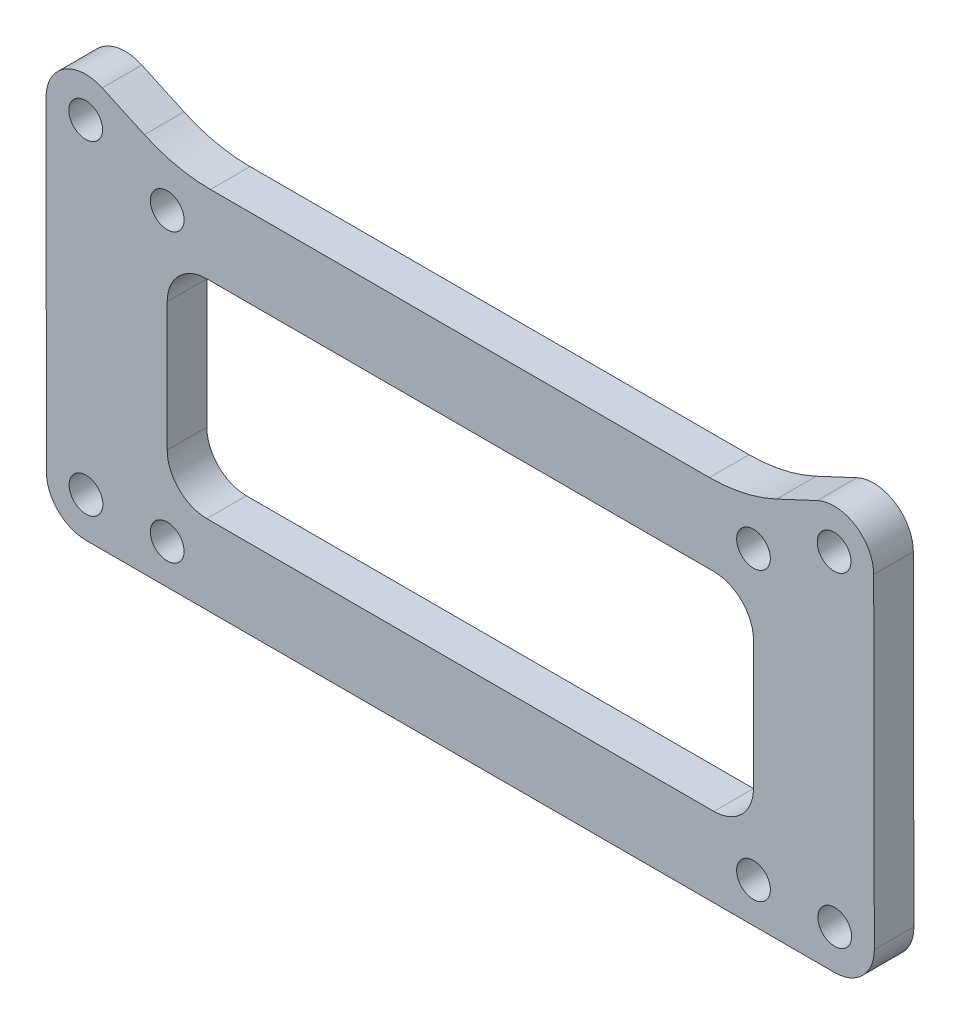
ISO-10303-21;
HEADER;
FILE_DESCRIPTION(('STEP AP214'),'2;1');
FILE_NAME('part.step','',(''),(''),'','','');
FILE_SCHEMA(('AUTOMOTIVE_DESIGN { 1 0 10303 214 1 1 1 1 }'));
ENDSEC;
DATA;
#1=APPLICATION_CONTEXT('core data for automotive mechanical design processes');
#2=APPLICATION_PROTOCOL_DEFINITION('international standard','automotive_design',2000,#1);
#3=PRODUCT_CONTEXT('',#1,'mechanical');
#4=PRODUCT('Part','Part','',(#3));
#5=PRODUCT_RELATED_PRODUCT_CATEGORY('part','',(#4));
#6=PRODUCT_DEFINITION_FORMATION('','',#4);
#7=PRODUCT_DEFINITION_CONTEXT('part definition',#1,'design');
#8=PRODUCT_DEFINITION('design','',#6,#7);
#9=PRODUCT_DEFINITION_SHAPE('','',#8);
#10=(LENGTH_UNIT() NAMED_UNIT(*) SI_UNIT(.MILLI.,.METRE.));
#11=(NAMED_UNIT(*) PLANE_ANGLE_UNIT() SI_UNIT($,.RADIAN.));
#12=(NAMED_UNIT(*) SI_UNIT($,.STERADIAN.) SOLID_ANGLE_UNIT());
#13=UNCERTAINTY_MEASURE_WITH_UNIT(LENGTH_MEASURE(1.E-05),#10,'distance_accuracy_value','');
#14=(GEOMETRIC_REPRESENTATION_CONTEXT(3) GLOBAL_UNCERTAINTY_ASSIGNED_CONTEXT((#13)) GLOBAL_UNIT_ASSIGNED_CONTEXT((#10,
#11,#12)) REPRESENTATION_CONTEXT('',''));
#15=CARTESIAN_POINT('',(0.,0.,0.));
#16=DIRECTION('',(0.,0.,1.));
#17=DIRECTION('',(1.,0.,0.));
#18=AXIS2_PLACEMENT_3D('',#15,#16,#17);
#19=CARTESIAN_POINT('',(6.5125,0.,3.175));
#20=DIRECTION('',(-1.,0.,0.));
#21=DIRECTION('',(0.,0.,1.));
#22=AXIS2_PLACEMENT_3D('',#19,#20,#21);
#23=PLANE('',#22);
#24=DIRECTION('',(0.,1.,0.));
#25=VECTOR('',#24,1.);
#26=CARTESIAN_POINT('',(6.5125,0.,3.175));
#27=LINE('',#26,#25);
#28=CARTESIAN_POINT('',(6.5125,6.34999999999997,3.175));
#29=VERTEX_POINT('',#28);
#30=CARTESIAN_POINT('',(6.5125,16.65,3.175));
#31=VERTEX_POINT('',#30);
#32=EDGE_CURVE('E279',#29,#31,#27,.T.);
#33=ORIENTED_EDGE('',*,*,#32,.F.);
#34=DIRECTION('',(0.,0.,-1.));
#35=VECTOR('',#34,1.);
#36=CARTESIAN_POINT('',(6.5125,6.34999999999997,0.));
#37=LINE('',#36,#35);
#38=CARTESIAN_POINT('',(6.5125,6.34999999999997,0.));
#39=VERTEX_POINT('',#38);
#40=EDGE_CURVE('E198',#29,#39,#37,.T.);
#41=ORIENTED_EDGE('',*,*,#40,.T.);
#42=DIRECTION('',(0.,1.,0.));
#43=VECTOR('',#42,1.);
#44=CARTESIAN_POINT('',(6.5125,0.,0.));
#45=LINE('',#44,#43);
#46=CARTESIAN_POINT('',(6.5125,16.65,0.));
#47=VERTEX_POINT('',#46);
#48=EDGE_CURVE('E313',#39,#47,#45,.T.);
#49=ORIENTED_EDGE('',*,*,#48,.T.);
#50=DIRECTION('',(0.,0.,-1.));
#51=VECTOR('',#50,1.);
#52=CARTESIAN_POINT('',(6.5125,16.65,3.175));
#53=LINE('',#52,#51);
#54=EDGE_CURVE('E196',#47,#31,#53,.F.);
#55=ORIENTED_EDGE('',*,*,#54,.T.);
#56=EDGE_LOOP('',(#33,#41,#49,#55));
#57=FACE_BOUND('',#56,.T.);
#58=ADVANCED_FACE('F35',(#57),#23,.F.);
#59=CARTESIAN_POINT('',(0.,19.825,3.175));
#60=DIRECTION('',(0.,-1.,0.));
#61=DIRECTION('',(0.,0.,-1.));
#62=AXIS2_PLACEMENT_3D('',#59,#60,#61);
#63=PLANE('',#62);
#64=DIRECTION('',(-1.,0.,0.));
#65=VECTOR('',#64,1.);
#66=CARTESIAN_POINT('',(0.,19.825,0.));
#67=LINE('',#66,#65);
#68=CARTESIAN_POINT('',(50.3375,19.825,0.));
#69=VERTEX_POINT('',#68);
#70=CARTESIAN_POINT('',(9.6875,19.825,0.));
#71=VERTEX_POINT('',#70);
#72=EDGE_CURVE('E316',#69,#71,#67,.T.);
#73=ORIENTED_EDGE('',*,*,#72,.F.);
#74=DIRECTION('',(0.,0.,-1.));
#75=VECTOR('',#74,1.);
#76=CARTESIAN_POINT('',(50.3375,19.825,3.175));
#77=LINE('',#76,#75);
#78=CARTESIAN_POINT('',(50.3375,19.825,3.175));
#79=VERTEX_POINT('',#78);
#80=EDGE_CURVE('E219',#69,#79,#77,.F.);
#81=ORIENTED_EDGE('',*,*,#80,.T.);
#82=DIRECTION('',(-1.,0.,0.));
#83=VECTOR('',#82,1.);
#84=CARTESIAN_POINT('',(0.,19.825,3.175));
#85=LINE('',#84,#83);
#86=CARTESIAN_POINT('',(9.6875,19.825,3.175));
#87=VERTEX_POINT('',#86);
#88=EDGE_CURVE('E282',#79,#87,#85,.T.);
#89=ORIENTED_EDGE('',*,*,#88,.T.);
#90=DIRECTION('',(0.,0.,-1.));
#91=VECTOR('',#90,1.);
#92=CARTESIAN_POINT('',(9.6875,19.825,3.175));
#93=LINE('',#92,#91);
#94=EDGE_CURVE('E216',#87,#71,#93,.T.);
#95=ORIENTED_EDGE('',*,*,#94,.T.);
#96=EDGE_LOOP('',(#73,#81,#89,#95));
#97=FACE_BOUND('',#96,.T.);
#98=ADVANCED_FACE('F442',(#97),#63,.T.);
#99=CARTESIAN_POINT('',(53.5125,0.,3.175));
#100=DIRECTION('',(-1.,0.,0.));
#101=DIRECTION('',(0.,0.,1.));
#102=AXIS2_PLACEMENT_3D('',#99,#100,#101);
#103=PLANE('',#102);
#104=DIRECTION('',(0.,1.,0.));
#105=VECTOR('',#104,1.);
#106=CARTESIAN_POINT('',(53.5125,0.,0.));
#107=LINE('',#106,#105);
#108=CARTESIAN_POINT('',(53.5125,6.34999999999997,0.));
#109=VERTEX_POINT('',#108);
#110=CARTESIAN_POINT('',(53.5125,16.65,0.));
#111=VERTEX_POINT('',#110);
#112=EDGE_CURVE('E319',#109,#111,#107,.T.);
#113=ORIENTED_EDGE('',*,*,#112,.F.);
#114=DIRECTION('',(0.,0.,-1.));
#115=VECTOR('',#114,1.);
#116=CARTESIAN_POINT('',(53.5125,6.34999999999997,3.175));
#117=LINE('',#116,#115);
#118=CARTESIAN_POINT('',(53.5125,6.34999999999997,3.175));
#119=VERTEX_POINT('',#118);
#120=EDGE_CURVE('E214',#109,#119,#117,.F.);
#121=ORIENTED_EDGE('',*,*,#120,.T.);
#122=DIRECTION('',(0.,1.,0.));
#123=VECTOR('',#122,1.);
#124=CARTESIAN_POINT('',(53.5125,0.,3.175));
#125=LINE('',#124,#123);
#126=CARTESIAN_POINT('',(53.5125,16.65,3.175));
#127=VERTEX_POINT('',#126);
#128=EDGE_CURVE('E285',#119,#127,#125,.T.);
#129=ORIENTED_EDGE('',*,*,#128,.T.);
#130=DIRECTION('',(0.,0.,-1.));
#131=VECTOR('',#130,1.);
#132=CARTESIAN_POINT('',(53.5125,16.65,0.));
#133=LINE('',#132,#131);
#134=EDGE_CURVE('E211',#127,#111,#133,.T.);
#135=ORIENTED_EDGE('',*,*,#134,.T.);
#136=EDGE_LOOP('',(#113,#121,#129,#135));
#137=FACE_BOUND('',#136,.T.);
#138=ADVANCED_FACE('F448',(#137),#103,.T.);
#139=CARTESIAN_POINT('',(0.,0.,3.175));
#140=DIRECTION('',(0.,0.,-1.));
#141=DIRECTION('',(-1.,0.,0.));
#142=AXIS2_PLACEMENT_3D('',#139,#140,#141);
#143=CYLINDRICAL_SURFACE('',#142,3.175);
#144=CARTESIAN_POINT('',(0.,0.,0.));
#145=DIRECTION('',(0.,0.,1.));
#146=DIRECTION('',(1.,0.,0.));
#147=AXIS2_PLACEMENT_3D('',#144,#145,#146);
#148=CIRCLE('',#147,3.175);
#149=CARTESIAN_POINT('',(-3.175,0.,0.));
#150=VERTEX_POINT('',#149);
#151=CARTESIAN_POINT('',(0.,-3.17500000000001,0.));
#152=VERTEX_POINT('',#151);
#153=EDGE_CURVE('E195',#150,#152,#148,.T.);
#154=ORIENTED_EDGE('',*,*,#153,.T.);
#155=DIRECTION('',(0.,0.,-1.));
#156=VECTOR('',#155,1.);
#157=CARTESIAN_POINT('',(0.,-3.17500000000001,3.175));
#158=LINE('',#157,#156);
#159=CARTESIAN_POINT('',(0.,-3.17500000000001,3.175));
#160=VERTEX_POINT('',#159);
#161=EDGE_CURVE('E176',#160,#152,#158,.T.);
#162=ORIENTED_EDGE('',*,*,#161,.F.);
#163=CARTESIAN_POINT('',(0.,0.,3.175));
#164=DIRECTION('',(0.,0.,1.));
#165=DIRECTION('',(1.,0.,0.));
#166=AXIS2_PLACEMENT_3D('',#163,#164,#165);
#167=CIRCLE('',#166,3.175);
#168=CARTESIAN_POINT('',(-3.175,0.,3.175));
#169=VERTEX_POINT('',#168);
#170=EDGE_CURVE('E182',#169,#160,#167,.T.);
#171=ORIENTED_EDGE('',*,*,#170,.F.);
#172=DIRECTION('',(0.,0.,-1.));
#173=VECTOR('',#172,1.);
#174=CARTESIAN_POINT('',(-3.175,0.,3.175));
#175=LINE('',#174,#173);
#176=EDGE_CURVE('E291',#169,#150,#175,.T.);
#177=ORIENTED_EDGE('',*,*,#176,.T.);
#178=EDGE_LOOP('',(#154,#162,#171,#177));
#179=FACE_BOUND('',#178,.T.);
#180=ADVANCED_FACE('F193',(#179),#143,.T.);
#181=CARTESIAN_POINT('',(0.,-3.17500000000002,3.175));
#182=DIRECTION('',(0.,1.,0.));
#183=DIRECTION('',(0.,0.,1.));
#184=AXIS2_PLACEMENT_3D('',#181,#182,#183);
#185=PLANE('',#184);
#186=DIRECTION('',(1.,0.,0.));
#187=VECTOR('',#186,1.);
#188=CARTESIAN_POINT('',(0.,-3.17500000000002,0.));
#189=LINE('',#188,#187);
#190=CARTESIAN_POINT('',(60.025,-3.17500000000002,0.));
#191=VERTEX_POINT('',#190);
#192=EDGE_CURVE('E293',#152,#191,#189,.T.);
#193=ORIENTED_EDGE('',*,*,#192,.T.);
#194=DIRECTION('',(0.,0.,-1.));
#195=VECTOR('',#194,1.);
#196=CARTESIAN_POINT('',(60.025,-3.17500000000002,3.175));
#197=LINE('',#196,#195);
#198=CARTESIAN_POINT('',(60.025,-3.17500000000002,3.175));
#199=VERTEX_POINT('',#198);
#200=EDGE_CURVE('E179',#199,#191,#197,.T.);
#201=ORIENTED_EDGE('',*,*,#200,.F.);
#202=DIRECTION('',(1.,0.,0.));
#203=VECTOR('',#202,1.);
#204=CARTESIAN_POINT('',(0.,-3.17500000000002,3.175));
#205=LINE('',#204,#203);
#206=EDGE_CURVE('E172',#160,#199,#205,.T.);
#207=ORIENTED_EDGE('',*,*,#206,.F.);
#208=ORIENTED_EDGE('',*,*,#161,.T.);
#209=EDGE_LOOP('',(#193,#201,#207,#208));
#210=FACE_BOUND('',#209,.T.);
#211=ADVANCED_FACE('F174',(#210),#185,.F.);
#212=CARTESIAN_POINT('',(60.025,0.,3.175));
#213=DIRECTION('',(0.,0.,-1.));
#214=DIRECTION('',(-1.,0.,0.));
#215=AXIS2_PLACEMENT_3D('',#212,#213,#214);
#216=CYLINDRICAL_SURFACE('',#215,3.175);
#217=CARTESIAN_POINT('',(60.025,0.,0.));
#218=DIRECTION('',(0.,0.,1.));
#219=DIRECTION('',(1.,0.,0.));
#220=AXIS2_PLACEMENT_3D('',#217,#218,#219);
#221=CIRCLE('',#220,3.175);
#222=CARTESIAN_POINT('',(63.1999941389844,0.00610060771077896,0.));
#223=VERTEX_POINT('',#222);
#224=EDGE_CURVE('E296',#191,#223,#221,.T.);
#225=ORIENTED_EDGE('',*,*,#224,.T.);
#226=DIRECTION('',(0.,0.,-1.));
#227=VECTOR('',#226,1.);
#228=CARTESIAN_POINT('',(63.1999941389844,0.00610060771077896,3.175));
#229=LINE('',#228,#227);
#230=CARTESIAN_POINT('',(63.1999941389844,0.00610060771077896,3.175));
#231=VERTEX_POINT('',#230);
#232=EDGE_CURVE('E200',#231,#223,#229,.T.);
#233=ORIENTED_EDGE('',*,*,#232,.F.);
#234=CARTESIAN_POINT('',(60.025,0.,3.175));
#235=DIRECTION('',(0.,0.,1.));
#236=DIRECTION('',(1.,0.,0.));
#237=AXIS2_PLACEMENT_3D('',#234,#235,#236);
#238=CIRCLE('',#237,3.175);
#239=EDGE_CURVE('E181',#199,#231,#238,.T.);
#240=ORIENTED_EDGE('',*,*,#239,.F.);
#241=ORIENTED_EDGE('',*,*,#200,.T.);
#242=EDGE_LOOP('',(#225,#233,#240,#241));
#243=FACE_BOUND('',#242,.T.);
#244=ADVANCED_FACE('F341',(#243),#216,.T.);
#245=CARTESIAN_POINT('',(63.1997725281913,0.121435505934334,3.175));
#246=DIRECTION('',(0.999998154010848,0.00192145124749522,0.));
#247=DIRECTION('',(-0.00192145124749522,0.999998154010848,0.));
#248=AXIS2_PLACEMENT_3D('',#245,#246,#247);
#249=PLANE('',#248);
#250=DIRECTION('',(0.00192145124749522,-0.999998154010848,0.));
#251=VECTOR('',#250,1.);
#252=CARTESIAN_POINT('',(63.1997725281913,0.121435505934334,0.));
#253=LINE('',#252,#251);
#254=CARTESIAN_POINT('',(63.15,26.025,0.));
#255=VERTEX_POINT('',#254);
#256=EDGE_CURVE('E299',#255,#223,#253,.T.);
#257=ORIENTED_EDGE('',*,*,#256,.F.);
#258=DIRECTION('',(0.,0.,-1.));
#259=VECTOR('',#258,1.);
#260=CARTESIAN_POINT('',(63.15,26.025,3.175));
#261=LINE('',#260,#259);
#262=CARTESIAN_POINT('',(63.15,26.025,3.175));
#263=VERTEX_POINT('',#262);
#264=EDGE_CURVE('E331',#263,#255,#261,.T.);
#265=ORIENTED_EDGE('',*,*,#264,.F.);
#266=DIRECTION('',(0.00192145124749522,-0.999998154010848,0.));
#267=VECTOR('',#266,1.);
#268=CARTESIAN_POINT('',(63.1997725281913,0.121435505934334,3.175));
#269=LINE('',#268,#267);
#270=EDGE_CURVE('E338',#263,#231,#269,.T.);
#271=ORIENTED_EDGE('',*,*,#270,.T.);
#272=ORIENTED_EDGE('',*,*,#232,.T.);
#273=EDGE_LOOP('',(#257,#265,#271,#272));
#274=FACE_BOUND('',#273,.T.);
#275=ADVANCED_FACE('F336',(#274),#249,.T.);
#276=CARTESIAN_POINT('',(59.975,26.025,3.175));
#277=DIRECTION('',(0.,0.,-1.));
#278=DIRECTION('',(-1.,0.,0.));
#279=AXIS2_PLACEMENT_3D('',#276,#277,#278);
#280=CYLINDRICAL_SURFACE('',#279,3.175);
#281=CARTESIAN_POINT('',(59.975,26.025,0.));
#282=DIRECTION('',(0.,0.,1.));
#283=DIRECTION('',(1.,0.,0.));
#284=AXIS2_PLACEMENT_3D('',#281,#282,#283);
#285=CIRCLE('',#284,3.175);
#286=CARTESIAN_POINT('',(58.6289901632956,28.900566469323,0.));
#287=VERTEX_POINT('',#286);
#288=EDGE_CURVE('E302',#255,#287,#285,.T.);
#289=ORIENTED_EDGE('',*,*,#288,.T.);
#290=DIRECTION('',(0.,0.,-1.));
#291=VECTOR('',#290,1.);
#292=CARTESIAN_POINT('',(58.6289901632956,28.900566469323,3.175));
#293=LINE('',#292,#291);
#294=CARTESIAN_POINT('',(58.6289901632956,28.900566469323,3.175));
#295=VERTEX_POINT('',#294);
#296=EDGE_CURVE('E328',#295,#287,#293,.T.);
#297=ORIENTED_EDGE('',*,*,#296,.F.);
#298=CARTESIAN_POINT('',(59.975,26.025,3.175));
#299=DIRECTION('',(0.,0.,1.));
#300=DIRECTION('',(1.,0.,0.));
#301=AXIS2_PLACEMENT_3D('',#298,#299,#300);
#302=CIRCLE('',#301,3.175);
#303=EDGE_CURVE('E354',#263,#295,#302,.T.);
#304=ORIENTED_EDGE('',*,*,#303,.F.);
#305=ORIENTED_EDGE('',*,*,#264,.T.);
#306=EDGE_LOOP('',(#289,#297,#304,#305));
#307=FACE_BOUND('',#306,.T.);
#308=ADVANCED_FACE('F346',(#307),#280,.T.);
#309=CARTESIAN_POINT('',(-0.559507794372429,1.19531210615928,3.175));
#310=DIRECTION('',(0.42394010604863,-0.905690226558439,0.));
#311=DIRECTION('',(0.905690226558439,0.42394010604863,0.));
#312=AXIS2_PLACEMENT_3D('',#309,#310,#311);
#313=PLANE('',#312);
#314=DIRECTION('',(-0.905690226558439,-0.42394010604863,0.));
#315=VECTOR('',#314,1.);
#316=CARTESIAN_POINT('',(-0.559507794372429,1.19531210615928,0.));
#317=LINE('',#316,#315);
#318=CARTESIAN_POINT('',(55.3649846955268,27.3727341227078,0.));
#319=VERTEX_POINT('',#318);
#320=EDGE_CURVE('E263',#287,#319,#317,.T.);
#321=ORIENTED_EDGE('',*,*,#320,.T.);
#322=DIRECTION('',(0.,0.,-1.));
#323=VECTOR('',#322,1.);
#324=CARTESIAN_POINT('',(55.3649846955268,27.3727341227078,3.175));
#325=LINE('',#324,#323);
#326=CARTESIAN_POINT('',(55.3649846955268,27.3727341227078,3.175));
#327=VERTEX_POINT('',#326);
#328=EDGE_CURVE('E242',#319,#327,#325,.F.);
#329=ORIENTED_EDGE('',*,*,#328,.T.);
#330=DIRECTION('',(-0.905690226558439,-0.42394010604863,0.));
#331=VECTOR('',#330,1.);
#332=CARTESIAN_POINT('',(-0.559507794372429,1.19531210615928,3.175));
#333=LINE('',#332,#331);
#334=EDGE_CURVE('E274',#295,#327,#333,.T.);
#335=ORIENTED_EDGE('',*,*,#334,.F.);
#336=ORIENTED_EDGE('',*,*,#296,.T.);
#337=EDGE_LOOP('',(#321,#329,#335,#336));
#338=FACE_BOUND('',#337,.T.);
#339=ADVANCED_FACE('F350',(#338),#313,.F.);
#340=CARTESIAN_POINT('',(0.,26.175,3.175));
#341=DIRECTION('',(0.,1.,0.));
#342=DIRECTION('',(0.,0.,1.));
#343=AXIS2_PLACEMENT_3D('',#340,#341,#342);
#344=PLANE('',#343);
#345=DIRECTION('',(1.,0.,0.));
#346=VECTOR('',#345,1.);
#347=CARTESIAN_POINT('',(0.,26.175,3.175));
#348=LINE('',#347,#346);
#349=CARTESIAN_POINT('',(9.98106142452709,26.175,3.175));
#350=VERTEX_POINT('',#349);
#351=CARTESIAN_POINT('',(49.9809453487091,26.175,3.175));
#352=VERTEX_POINT('',#351);
#353=EDGE_CURVE('E271',#350,#352,#348,.T.);
#354=ORIENTED_EDGE('',*,*,#353,.T.);
#355=DIRECTION('',(0.,0.,-1.));
#356=VECTOR('',#355,1.);
#357=CARTESIAN_POINT('',(49.9809453487091,26.175,3.175));
#358=LINE('',#357,#356);
#359=CARTESIAN_POINT('',(49.9809453487091,26.175,0.));
#360=VERTEX_POINT('',#359);
#361=EDGE_CURVE('E239',#352,#360,#358,.T.);
#362=ORIENTED_EDGE('',*,*,#361,.T.);
#363=DIRECTION('',(1.,0.,0.));
#364=VECTOR('',#363,1.);
#365=CARTESIAN_POINT('',(0.,26.175,0.));
#366=LINE('',#365,#364);
#367=CARTESIAN_POINT('',(9.98106142452709,26.175,0.));
#368=VERTEX_POINT('',#367);
#369=EDGE_CURVE('E255',#368,#360,#366,.T.);
#370=ORIENTED_EDGE('',*,*,#369,.F.);
#371=DIRECTION('',(0.,0.,-1.));
#372=VECTOR('',#371,1.);
#373=CARTESIAN_POINT('',(9.98106142452709,26.175,3.175));
#374=LINE('',#373,#372);
#375=EDGE_CURVE('E237',#368,#350,#374,.F.);
#376=ORIENTED_EDGE('',*,*,#375,.T.);
#377=EDGE_LOOP('',(#354,#362,#370,#376));
#378=FACE_BOUND('',#377,.T.);
#379=ADVANCED_FACE('F261',(#378),#344,.T.);
#380=CARTESIAN_POINT('',(11.1755956971772,24.3534856234317,3.175));
#381=DIRECTION('',(0.417073534950143,0.908872744912175,0.));
#382=DIRECTION('',(-0.908872744912176,0.417073534950143,0.));
#383=AXIS2_PLACEMENT_3D('',#380,#381,#382);
#384=PLANE('',#383);
#385=DIRECTION('',(0.908872744912175,-0.417073534950143,0.));
#386=VECTOR('',#385,1.);
#387=CARTESIAN_POINT('',(11.1755956971772,24.3534856234317,3.175));
#388=LINE('',#387,#386);
#389=CARTESIAN_POINT('',(1.29920847346672,28.8856709650962,3.175));
#390=VERTEX_POINT('',#389);
#391=CARTESIAN_POINT('',(4.68422753066028,27.3323161396153,3.175));
#392=VERTEX_POINT('',#391);
#393=EDGE_CURVE('E267',#390,#392,#388,.T.);
#394=ORIENTED_EDGE('',*,*,#393,.T.);
#395=DIRECTION('',(0.,0.,-1.));
#396=VECTOR('',#395,1.);
#397=CARTESIAN_POINT('',(4.68422753066028,27.3323161396154,0.));
#398=LINE('',#397,#396);
#399=CARTESIAN_POINT('',(4.68422753066028,27.3323161396153,0.));
#400=VERTEX_POINT('',#399);
#401=EDGE_CURVE('E244',#392,#400,#398,.T.);
#402=ORIENTED_EDGE('',*,*,#401,.T.);
#403=DIRECTION('',(0.908872744912175,-0.417073534950143,0.));
#404=VECTOR('',#403,1.);
#405=CARTESIAN_POINT('',(11.1755956971772,24.3534856234317,0.));
#406=LINE('',#405,#404);
#407=CARTESIAN_POINT('',(1.29920847346672,28.8856709650962,0.));
#408=VERTEX_POINT('',#407);
#409=EDGE_CURVE('E258',#408,#400,#406,.T.);
#410=ORIENTED_EDGE('',*,*,#409,.F.);
#411=DIRECTION('',(0.,0.,-1.));
#412=VECTOR('',#411,1.);
#413=CARTESIAN_POINT('',(1.29920847346672,28.8856709650962,3.175));
#414=LINE('',#413,#412);
#415=EDGE_CURVE('E268',#390,#408,#414,.T.);
#416=ORIENTED_EDGE('',*,*,#415,.F.);
#417=EDGE_LOOP('',(#394,#402,#410,#416));
#418=FACE_BOUND('',#417,.T.);
#419=ADVANCED_FACE('F266',(#418),#384,.T.);
#420=CARTESIAN_POINT('',(-0.0249999999999834,26.,3.175));
#421=DIRECTION('',(0.,0.,-1.));
#422=DIRECTION('',(-1.,0.,0.));
#423=AXIS2_PLACEMENT_3D('',#420,#421,#422);
#424=CYLINDRICAL_SURFACE('',#423,3.175);
#425=CARTESIAN_POINT('',(-0.0249999999999834,26.,0.));
#426=DIRECTION('',(0.,0.,1.));
#427=DIRECTION('',(1.,0.,0.));
#428=AXIS2_PLACEMENT_3D('',#425,#426,#427);
#429=CIRCLE('',#428,3.175);
#430=CARTESIAN_POINT('',(-3.19999999999998,26.,0.));
#431=VERTEX_POINT('',#430);
#432=EDGE_CURVE('E307',#408,#431,#429,.T.);
#433=ORIENTED_EDGE('',*,*,#432,.T.);
#434=DIRECTION('',(0.,0.,-1.));
#435=VECTOR('',#434,1.);
#436=CARTESIAN_POINT('',(-3.19999999999998,26.,3.175));
#437=LINE('',#436,#435);
#438=CARTESIAN_POINT('',(-3.19999999999998,26.,3.175));
#439=VERTEX_POINT('',#438);
#440=EDGE_CURVE('E325',#439,#431,#437,.T.);
#441=ORIENTED_EDGE('',*,*,#440,.F.);
#442=CARTESIAN_POINT('',(-0.0249999999999834,26.,3.175));
#443=DIRECTION('',(0.,0.,1.));
#444=DIRECTION('',(1.,0.,0.));
#445=AXIS2_PLACEMENT_3D('',#442,#443,#444);
#446=CIRCLE('',#445,3.175);
#447=EDGE_CURVE('E270',#390,#439,#446,.T.);
#448=ORIENTED_EDGE('',*,*,#447,.F.);
#449=ORIENTED_EDGE('',*,*,#415,.T.);
#450=EDGE_LOOP('',(#433,#441,#448,#449));
#451=FACE_BOUND('',#450,.T.);
#452=ADVANCED_FACE('F457',(#451),#424,.T.);
#453=CARTESIAN_POINT('',(-3.17499706453674,-0.00305288179282175,3.175));
#454=DIRECTION('',(-0.999999537722214,-0.000961538017039951,0.));
#455=DIRECTION('',(0.000961538017039951,-0.999999537722214,0.));
#456=AXIS2_PLACEMENT_3D('',#453,#454,#455);
#457=PLANE('',#456);
#458=DIRECTION('',(-0.000961538017039951,0.999999537722214,0.));
#459=VECTOR('',#458,1.);
#460=CARTESIAN_POINT('',(-3.17499706453674,-0.00305288179282175,0.));
#461=LINE('',#460,#459);
#462=EDGE_CURVE('E310',#150,#431,#461,.T.);
#463=ORIENTED_EDGE('',*,*,#462,.F.);
#464=ORIENTED_EDGE('',*,*,#176,.F.);
#465=DIRECTION('',(-0.000961538017039951,0.999999537722214,0.));
#466=VECTOR('',#465,1.);
#467=CARTESIAN_POINT('',(-3.17499706453674,-0.00305288179282175,3.175));
#468=LINE('',#467,#466);
#469=EDGE_CURVE('E189',#169,#439,#468,.T.);
#470=ORIENTED_EDGE('',*,*,#469,.T.);
#471=ORIENTED_EDGE('',*,*,#440,.T.);
#472=EDGE_LOOP('',(#463,#464,#470,#471));
#473=FACE_BOUND('',#472,.T.);
#474=ADVANCED_FACE('F454',(#473),#457,.T.);
#475=CARTESIAN_POINT('',(0.,3.17499999999997,3.175));
#476=DIRECTION('',(0.,-1.,0.));
#477=DIRECTION('',(0.,0.,-1.));
#478=AXIS2_PLACEMENT_3D('',#475,#476,#477);
#479=PLANE('',#478);
#480=DIRECTION('',(-1.,0.,0.));
#481=VECTOR('',#480,1.);
#482=CARTESIAN_POINT('',(0.,3.17499999999997,0.));
#483=LINE('',#482,#481);
#484=CARTESIAN_POINT('',(50.3375,3.17499999999997,0.));
#485=VERTEX_POINT('',#484);
#486=CARTESIAN_POINT('',(9.6875,3.17499999999997,0.));
#487=VERTEX_POINT('',#486);
#488=EDGE_CURVE('E191',#485,#487,#483,.T.);
#489=ORIENTED_EDGE('',*,*,#488,.T.);
#490=DIRECTION('',(0.,0.,-1.));
#491=VECTOR('',#490,1.);
#492=CARTESIAN_POINT('',(9.6875,3.17499999999997,3.175));
#493=LINE('',#492,#491);
#494=CARTESIAN_POINT('',(9.6875,3.17499999999997,3.175));
#495=VERTEX_POINT('',#494);
#496=EDGE_CURVE('E209',#487,#495,#493,.F.);
#497=ORIENTED_EDGE('',*,*,#496,.T.);
#498=DIRECTION('',(-1.,0.,0.));
#499=VECTOR('',#498,1.);
#500=CARTESIAN_POINT('',(0.,3.17499999999997,3.175));
#501=LINE('',#500,#499);
#502=CARTESIAN_POINT('',(50.3375,3.17499999999997,3.175));
#503=VERTEX_POINT('',#502);
#504=EDGE_CURVE('E288',#503,#495,#501,.T.);
#505=ORIENTED_EDGE('',*,*,#504,.F.);
#506=DIRECTION('',(0.,0.,-1.));
#507=VECTOR('',#506,1.);
#508=CARTESIAN_POINT('',(50.3375,3.17499999999997,3.175));
#509=LINE('',#508,#507);
#510=EDGE_CURVE('E206',#503,#485,#509,.T.);
#511=ORIENTED_EDGE('',*,*,#510,.T.);
#512=EDGE_LOOP('',(#489,#497,#505,#511));
#513=FACE_BOUND('',#512,.T.);
#514=ADVANCED_FACE('F411',(#513),#479,.F.);
#515=CARTESIAN_POINT('',(0.,0.,3.175));
#516=DIRECTION('',(0.,0.,1.));
#517=DIRECTION('',(1.,0.,0.));
#518=AXIS2_PLACEMENT_3D('',#515,#516,#517);
#519=PLANE('',#518);
#520=CARTESIAN_POINT('',(-0.0249999999999834,26.,3.175));
#521=DIRECTION('',(0.,0.,1.));
#522=DIRECTION('',(1.,0.,0.));
#523=AXIS2_PLACEMENT_3D('',#520,#521,#522);
#524=CIRCLE('',#523,1.35255);
#525=CARTESIAN_POINT('',(1.32755000000002,26.,3.175));
#526=VERTEX_POINT('',#525);
#527=EDGE_CURVE('E403',#526,#526,#524,.T.);
#528=ORIENTED_EDGE('',*,*,#527,.F.);
#529=EDGE_LOOP('',(#528));
#530=FACE_BOUND('',#529,.T.);
#531=CARTESIAN_POINT('',(0.,0.,3.175));
#532=DIRECTION('',(0.,0.,1.));
#533=DIRECTION('',(1.,0.,0.));
#534=AXIS2_PLACEMENT_3D('',#531,#532,#533);
#535=CIRCLE('',#534,1.35255);
#536=CARTESIAN_POINT('',(1.35255,0.,3.175));
#537=VERTEX_POINT('',#536);
#538=EDGE_CURVE('E397',#537,#537,#535,.T.);
#539=ORIENTED_EDGE('',*,*,#538,.F.);
#540=EDGE_LOOP('',(#539));
#541=FACE_BOUND('',#540,.T.);
#542=CARTESIAN_POINT('',(60.025,0.,3.175));
#543=DIRECTION('',(0.,0.,1.));
#544=DIRECTION('',(1.,0.,0.));
#545=AXIS2_PLACEMENT_3D('',#542,#543,#544);
#546=CIRCLE('',#545,1.35255);
#547=CARTESIAN_POINT('',(61.37755,0.,3.175));
#548=VERTEX_POINT('',#547);
#549=EDGE_CURVE('E391',#548,#548,#546,.T.);
#550=ORIENTED_EDGE('',*,*,#549,.F.);
#551=EDGE_LOOP('',(#550));
#552=FACE_BOUND('',#551,.T.);
#553=CARTESIAN_POINT('',(59.975,26.025,3.175));
#554=DIRECTION('',(0.,0.,1.));
#555=DIRECTION('',(1.,0.,0.));
#556=AXIS2_PLACEMENT_3D('',#553,#554,#555);
#557=CIRCLE('',#556,1.35255);
#558=CARTESIAN_POINT('',(61.32755,26.025,3.175));
#559=VERTEX_POINT('',#558);
#560=EDGE_CURVE('E385',#559,#559,#557,.T.);
#561=ORIENTED_EDGE('',*,*,#560,.F.);
#562=EDGE_LOOP('',(#561));
#563=FACE_BOUND('',#562,.T.);
#564=CARTESIAN_POINT('',(6.5125,23.,3.175));
#565=DIRECTION('',(0.,0.,1.));
#566=DIRECTION('',(1.,0.,0.));
#567=AXIS2_PLACEMENT_3D('',#564,#565,#566);
#568=CIRCLE('',#567,1.35254999999999);
#569=CARTESIAN_POINT('',(7.86504999999999,23.,3.175));
#570=VERTEX_POINT('',#569);
#571=EDGE_CURVE('E379',#570,#570,#568,.T.);
#572=ORIENTED_EDGE('',*,*,#571,.F.);
#573=EDGE_LOOP('',(#572));
#574=FACE_BOUND('',#573,.T.);
#575=CARTESIAN_POINT('',(53.5125,23.,3.175));
#576=DIRECTION('',(0.,0.,1.));
#577=DIRECTION('',(1.,0.,0.));
#578=AXIS2_PLACEMENT_3D('',#575,#576,#577);
#579=CIRCLE('',#578,1.35254999999999);
#580=CARTESIAN_POINT('',(54.86505,23.,3.175));
#581=VERTEX_POINT('',#580);
#582=EDGE_CURVE('E373',#581,#581,#579,.T.);
#583=ORIENTED_EDGE('',*,*,#582,.F.);
#584=EDGE_LOOP('',(#583));
#585=FACE_BOUND('',#584,.T.);
#586=CARTESIAN_POINT('',(53.5125,0.,3.175));
#587=DIRECTION('',(0.,0.,1.));
#588=DIRECTION('',(1.,0.,0.));
#589=AXIS2_PLACEMENT_3D('',#586,#587,#588);
#590=CIRCLE('',#589,1.35254999999999);
#591=CARTESIAN_POINT('',(54.86505,0.,3.175));
#592=VERTEX_POINT('',#591);
#593=EDGE_CURVE('E367',#592,#592,#590,.T.);
#594=ORIENTED_EDGE('',*,*,#593,.F.);
#595=EDGE_LOOP('',(#594));
#596=FACE_BOUND('',#595,.T.);
#597=CARTESIAN_POINT('',(6.5125,0.,3.175));
#598=DIRECTION('',(0.,0.,1.));
#599=DIRECTION('',(1.,0.,0.));
#600=AXIS2_PLACEMENT_3D('',#597,#598,#599);
#601=CIRCLE('',#600,1.35254999999999);
#602=CARTESIAN_POINT('',(7.86504999999999,0.,3.175));
#603=VERTEX_POINT('',#602);
#604=EDGE_CURVE('E361',#603,#603,#601,.T.);
#605=ORIENTED_EDGE('',*,*,#604,.F.);
#606=EDGE_LOOP('',(#605));
#607=FACE_BOUND('',#606,.T.);
#608=ORIENTED_EDGE('',*,*,#170,.T.);
#609=ORIENTED_EDGE('',*,*,#206,.T.);
#610=ORIENTED_EDGE('',*,*,#239,.T.);
#611=ORIENTED_EDGE('',*,*,#270,.F.);
#612=ORIENTED_EDGE('',*,*,#303,.T.);
#613=ORIENTED_EDGE('',*,*,#334,.T.);
#614=CARTESIAN_POINT('',(49.9809453487091,38.875,3.175));
#615=DIRECTION('',(0.,0.,1.));
#616=DIRECTION('',(1.,0.,0.));
#617=AXIS2_PLACEMENT_3D('',#614,#615,#616);
#618=CIRCLE('',#617,12.7);
#619=EDGE_CURVE('E248',#327,#352,#618,.F.);
#620=ORIENTED_EDGE('',*,*,#619,.T.);
#621=ORIENTED_EDGE('',*,*,#353,.F.);
#622=CARTESIAN_POINT('',(9.98106142452709,38.875,3.175));
#623=DIRECTION('',(0.,0.,1.));
#624=DIRECTION('',(1.,0.,0.));
#625=AXIS2_PLACEMENT_3D('',#622,#623,#624);
#626=CIRCLE('',#625,12.7);
#627=EDGE_CURVE('E11',#350,#392,#626,.F.);
#628=ORIENTED_EDGE('',*,*,#627,.T.);
#629=ORIENTED_EDGE('',*,*,#393,.F.);
#630=ORIENTED_EDGE('',*,*,#447,.T.);
#631=ORIENTED_EDGE('',*,*,#469,.F.);
#632=EDGE_LOOP('',(#608,#609,#610,#611,#612,#613,#620,#621,#628,#629,#630,#631));
#633=FACE_BOUND('',#632,.T.);
#634=ORIENTED_EDGE('',*,*,#504,.T.);
#635=CARTESIAN_POINT('',(9.6875,6.34999999999997,3.175));
#636=DIRECTION('',(0.,0.,1.));
#637=DIRECTION('',(1.,0.,0.));
#638=AXIS2_PLACEMENT_3D('',#635,#636,#637);
#639=CIRCLE('',#638,3.175);
#640=EDGE_CURVE('E223',#495,#29,#639,.F.);
#641=ORIENTED_EDGE('',*,*,#640,.T.);
#642=ORIENTED_EDGE('',*,*,#32,.T.);
#643=CARTESIAN_POINT('',(9.6875,16.65,3.175));
#644=DIRECTION('',(0.,0.,1.));
#645=DIRECTION('',(1.,0.,0.));
#646=AXIS2_PLACEMENT_3D('',#643,#644,#645);
#647=CIRCLE('',#646,3.175);
#648=EDGE_CURVE('E235',#31,#87,#647,.F.);
#649=ORIENTED_EDGE('',*,*,#648,.T.);
#650=ORIENTED_EDGE('',*,*,#88,.F.);
#651=CARTESIAN_POINT('',(50.3375,16.65,3.175));
#652=DIRECTION('',(0.,0.,1.));
#653=DIRECTION('',(1.,0.,0.));
#654=AXIS2_PLACEMENT_3D('',#651,#652,#653);
#655=CIRCLE('',#654,3.175);
#656=EDGE_CURVE('E231',#79,#127,#655,.F.);
#657=ORIENTED_EDGE('',*,*,#656,.T.);
#658=ORIENTED_EDGE('',*,*,#128,.F.);
#659=CARTESIAN_POINT('',(50.3375,6.34999999999997,3.175));
#660=DIRECTION('',(0.,0.,1.));
#661=DIRECTION('',(1.,0.,0.));
#662=AXIS2_PLACEMENT_3D('',#659,#660,#661);
#663=CIRCLE('',#662,3.175);
#664=EDGE_CURVE('E227',#119,#503,#663,.F.);
#665=ORIENTED_EDGE('',*,*,#664,.T.);
#666=EDGE_LOOP('',(#634,#641,#642,#649,#650,#657,#658,#665));
#667=FACE_BOUND('',#666,.T.);
#668=ADVANCED_FACE('F186',(#530,#541,#552,#563,#574,#585,#596,#607,#633,#667),#519,.T.);
#669=CARTESIAN_POINT('',(0.,0.,0.));
#670=DIRECTION('',(0.,0.,1.));
#671=DIRECTION('',(1.,0.,0.));
#672=AXIS2_PLACEMENT_3D('',#669,#670,#671);
#673=PLANE('',#672);
#674=CARTESIAN_POINT('',(-0.0249999999999834,26.,0.));
#675=DIRECTION('',(0.,0.,1.));
#676=DIRECTION('',(1.,0.,0.));
#677=AXIS2_PLACEMENT_3D('',#674,#675,#676);
#678=CIRCLE('',#677,1.35255);
#679=CARTESIAN_POINT('',(1.32755000000002,26.,0.));
#680=VERTEX_POINT('',#679);
#681=EDGE_CURVE('E400',#680,#680,#678,.T.);
#682=ORIENTED_EDGE('',*,*,#681,.T.);
#683=EDGE_LOOP('',(#682));
#684=FACE_BOUND('',#683,.T.);
#685=CARTESIAN_POINT('',(0.,0.,0.));
#686=DIRECTION('',(0.,0.,1.));
#687=DIRECTION('',(1.,0.,0.));
#688=AXIS2_PLACEMENT_3D('',#685,#686,#687);
#689=CIRCLE('',#688,1.35255);
#690=CARTESIAN_POINT('',(1.35255,0.,0.));
#691=VERTEX_POINT('',#690);
#692=EDGE_CURVE('E394',#691,#691,#689,.T.);
#693=ORIENTED_EDGE('',*,*,#692,.T.);
#694=EDGE_LOOP('',(#693));
#695=FACE_BOUND('',#694,.T.);
#696=CARTESIAN_POINT('',(60.025,0.,0.));
#697=DIRECTION('',(0.,0.,1.));
#698=DIRECTION('',(1.,0.,0.));
#699=AXIS2_PLACEMENT_3D('',#696,#697,#698);
#700=CIRCLE('',#699,1.35255);
#701=CARTESIAN_POINT('',(61.37755,0.,0.));
#702=VERTEX_POINT('',#701);
#703=EDGE_CURVE('E388',#702,#702,#700,.T.);
#704=ORIENTED_EDGE('',*,*,#703,.T.);
#705=EDGE_LOOP('',(#704));
#706=FACE_BOUND('',#705,.T.);
#707=CARTESIAN_POINT('',(59.975,26.025,0.));
#708=DIRECTION('',(0.,0.,1.));
#709=DIRECTION('',(1.,0.,0.));
#710=AXIS2_PLACEMENT_3D('',#707,#708,#709);
#711=CIRCLE('',#710,1.35255);
#712=CARTESIAN_POINT('',(61.32755,26.025,0.));
#713=VERTEX_POINT('',#712);
#714=EDGE_CURVE('E382',#713,#713,#711,.T.);
#715=ORIENTED_EDGE('',*,*,#714,.T.);
#716=EDGE_LOOP('',(#715));
#717=FACE_BOUND('',#716,.T.);
#718=CARTESIAN_POINT('',(6.5125,23.,0.));
#719=DIRECTION('',(0.,0.,1.));
#720=DIRECTION('',(1.,0.,0.));
#721=AXIS2_PLACEMENT_3D('',#718,#719,#720);
#722=CIRCLE('',#721,1.35254999999999);
#723=CARTESIAN_POINT('',(7.86504999999999,23.,0.));
#724=VERTEX_POINT('',#723);
#725=EDGE_CURVE('E376',#724,#724,#722,.T.);
#726=ORIENTED_EDGE('',*,*,#725,.T.);
#727=EDGE_LOOP('',(#726));
#728=FACE_BOUND('',#727,.T.);
#729=CARTESIAN_POINT('',(53.5125,23.,0.));
#730=DIRECTION('',(0.,0.,1.));
#731=DIRECTION('',(1.,0.,0.));
#732=AXIS2_PLACEMENT_3D('',#729,#730,#731);
#733=CIRCLE('',#732,1.35254999999999);
#734=CARTESIAN_POINT('',(54.86505,23.,0.));
#735=VERTEX_POINT('',#734);
#736=EDGE_CURVE('E370',#735,#735,#733,.T.);
#737=ORIENTED_EDGE('',*,*,#736,.T.);
#738=EDGE_LOOP('',(#737));
#739=FACE_BOUND('',#738,.T.);
#740=CARTESIAN_POINT('',(53.5125,0.,0.));
#741=DIRECTION('',(0.,0.,1.));
#742=DIRECTION('',(1.,0.,0.));
#743=AXIS2_PLACEMENT_3D('',#740,#741,#742);
#744=CIRCLE('',#743,1.35254999999999);
#745=CARTESIAN_POINT('',(54.86505,0.,0.));
#746=VERTEX_POINT('',#745);
#747=EDGE_CURVE('E364',#746,#746,#744,.T.);
#748=ORIENTED_EDGE('',*,*,#747,.T.);
#749=EDGE_LOOP('',(#748));
#750=FACE_BOUND('',#749,.T.);
#751=CARTESIAN_POINT('',(6.5125,0.,0.));
#752=DIRECTION('',(0.,0.,1.));
#753=DIRECTION('',(1.,0.,0.));
#754=AXIS2_PLACEMENT_3D('',#751,#752,#753);
#755=CIRCLE('',#754,1.35254999999999);
#756=CARTESIAN_POINT('',(7.86504999999999,0.,0.));
#757=VERTEX_POINT('',#756);
#758=EDGE_CURVE('E294',#757,#757,#755,.T.);
#759=ORIENTED_EDGE('',*,*,#758,.T.);
#760=EDGE_LOOP('',(#759));
#761=FACE_BOUND('',#760,.T.);
#762=ORIENTED_EDGE('',*,*,#153,.F.);
#763=ORIENTED_EDGE('',*,*,#462,.T.);
#764=ORIENTED_EDGE('',*,*,#432,.F.);
#765=ORIENTED_EDGE('',*,*,#409,.T.);
#766=CARTESIAN_POINT('',(9.98106142452709,38.875,0.));
#767=DIRECTION('',(0.,0.,1.));
#768=DIRECTION('',(1.,0.,0.));
#769=AXIS2_PLACEMENT_3D('',#766,#767,#768);
#770=CIRCLE('',#769,12.7);
#771=EDGE_CURVE('E43',#400,#368,#770,.T.);
#772=ORIENTED_EDGE('',*,*,#771,.T.);
#773=ORIENTED_EDGE('',*,*,#369,.T.);
#774=CARTESIAN_POINT('',(49.9809453487091,38.875,0.));
#775=DIRECTION('',(0.,0.,1.));
#776=DIRECTION('',(1.,0.,0.));
#777=AXIS2_PLACEMENT_3D('',#774,#775,#776);
#778=CIRCLE('',#777,12.7);
#779=EDGE_CURVE('E246',#360,#319,#778,.T.);
#780=ORIENTED_EDGE('',*,*,#779,.T.);
#781=ORIENTED_EDGE('',*,*,#320,.F.);
#782=ORIENTED_EDGE('',*,*,#288,.F.);
#783=ORIENTED_EDGE('',*,*,#256,.T.);
#784=ORIENTED_EDGE('',*,*,#224,.F.);
#785=ORIENTED_EDGE('',*,*,#192,.F.);
#786=EDGE_LOOP('',(#762,#763,#764,#765,#772,#773,#780,#781,#782,#783,#784,#785));
#787=FACE_BOUND('',#786,.T.);
#788=ORIENTED_EDGE('',*,*,#48,.F.);
#789=CARTESIAN_POINT('',(9.6875,6.34999999999997,0.));
#790=DIRECTION('',(0.,0.,1.));
#791=DIRECTION('',(1.,0.,0.));
#792=AXIS2_PLACEMENT_3D('',#789,#790,#791);
#793=CIRCLE('',#792,3.175);
#794=EDGE_CURVE('E221',#39,#487,#793,.T.);
#795=ORIENTED_EDGE('',*,*,#794,.T.);
#796=ORIENTED_EDGE('',*,*,#488,.F.);
#797=CARTESIAN_POINT('',(50.3375,6.34999999999997,0.));
#798=DIRECTION('',(0.,0.,1.));
#799=DIRECTION('',(1.,0.,0.));
#800=AXIS2_PLACEMENT_3D('',#797,#798,#799);
#801=CIRCLE('',#800,3.175);
#802=EDGE_CURVE('E225',#485,#109,#801,.T.);
#803=ORIENTED_EDGE('',*,*,#802,.T.);
#804=ORIENTED_EDGE('',*,*,#112,.T.);
#805=CARTESIAN_POINT('',(50.3375,16.65,0.));
#806=DIRECTION('',(0.,0.,1.));
#807=DIRECTION('',(1.,0.,0.));
#808=AXIS2_PLACEMENT_3D('',#805,#806,#807);
#809=CIRCLE('',#808,3.175);
#810=EDGE_CURVE('E229',#111,#69,#809,.T.);
#811=ORIENTED_EDGE('',*,*,#810,.T.);
#812=ORIENTED_EDGE('',*,*,#72,.T.);
#813=CARTESIAN_POINT('',(9.6875,16.65,0.));
#814=DIRECTION('',(0.,0.,1.));
#815=DIRECTION('',(1.,0.,0.));
#816=AXIS2_PLACEMENT_3D('',#813,#814,#815);
#817=CIRCLE('',#816,3.175);
#818=EDGE_CURVE('E233',#71,#47,#817,.T.);
#819=ORIENTED_EDGE('',*,*,#818,.T.);
#820=EDGE_LOOP('',(#788,#795,#796,#803,#804,#811,#812,#819));
#821=FACE_BOUND('',#820,.T.);
#822=ADVANCED_FACE('F253',(#684,#695,#706,#717,#728,#739,#750,#761,#787,#821),#673,.F.);
#823=CARTESIAN_POINT('',(9.6875,6.34999999999997,3.175));
#824=DIRECTION('',(0.,0.,1.));
#825=DIRECTION('',(1.,0.,0.));
#826=AXIS2_PLACEMENT_3D('',#823,#824,#825);
#827=CYLINDRICAL_SURFACE('',#826,3.175);
#828=ORIENTED_EDGE('',*,*,#640,.F.);
#829=ORIENTED_EDGE('',*,*,#496,.F.);
#830=ORIENTED_EDGE('',*,*,#794,.F.);
#831=ORIENTED_EDGE('',*,*,#40,.F.);
#832=EDGE_LOOP('',(#828,#829,#830,#831));
#833=FACE_BOUND('',#832,.T.);
#834=ADVANCED_FACE('F478',(#833),#827,.F.);
#835=CARTESIAN_POINT('',(50.3375,6.34999999999997,3.175));
#836=DIRECTION('',(0.,0.,-1.));
#837=DIRECTION('',(-1.,0.,0.));
#838=AXIS2_PLACEMENT_3D('',#835,#836,#837);
#839=CYLINDRICAL_SURFACE('',#838,3.175);
#840=ORIENTED_EDGE('',*,*,#664,.F.);
#841=ORIENTED_EDGE('',*,*,#120,.F.);
#842=ORIENTED_EDGE('',*,*,#802,.F.);
#843=ORIENTED_EDGE('',*,*,#510,.F.);
#844=EDGE_LOOP('',(#840,#841,#842,#843));
#845=FACE_BOUND('',#844,.T.);
#846=ADVANCED_FACE('F481',(#845),#839,.F.);
#847=CARTESIAN_POINT('',(50.3375,16.65,3.175));
#848=DIRECTION('',(0.,0.,1.));
#849=DIRECTION('',(1.,0.,0.));
#850=AXIS2_PLACEMENT_3D('',#847,#848,#849);
#851=CYLINDRICAL_SURFACE('',#850,3.175);
#852=ORIENTED_EDGE('',*,*,#656,.F.);
#853=ORIENTED_EDGE('',*,*,#80,.F.);
#854=ORIENTED_EDGE('',*,*,#810,.F.);
#855=ORIENTED_EDGE('',*,*,#134,.F.);
#856=EDGE_LOOP('',(#852,#853,#854,#855));
#857=FACE_BOUND('',#856,.T.);
#858=ADVANCED_FACE('F485',(#857),#851,.F.);
#859=CARTESIAN_POINT('',(9.6875,16.65,3.175));
#860=DIRECTION('',(0.,0.,-1.));
#861=DIRECTION('',(-1.,0.,0.));
#862=AXIS2_PLACEMENT_3D('',#859,#860,#861);
#863=CYLINDRICAL_SURFACE('',#862,3.175);
#864=ORIENTED_EDGE('',*,*,#648,.F.);
#865=ORIENTED_EDGE('',*,*,#54,.F.);
#866=ORIENTED_EDGE('',*,*,#818,.F.);
#867=ORIENTED_EDGE('',*,*,#94,.F.);
#868=EDGE_LOOP('',(#864,#865,#866,#867));
#869=FACE_BOUND('',#868,.T.);
#870=ADVANCED_FACE('F489',(#869),#863,.F.);
#871=CARTESIAN_POINT('',(49.9809453487091,38.875,3.175));
#872=DIRECTION('',(0.,0.,-1.));
#873=DIRECTION('',(-1.,0.,0.));
#874=AXIS2_PLACEMENT_3D('',#871,#872,#873);
#875=CYLINDRICAL_SURFACE('',#874,12.7);
#876=ORIENTED_EDGE('',*,*,#619,.F.);
#877=ORIENTED_EDGE('',*,*,#328,.F.);
#878=ORIENTED_EDGE('',*,*,#779,.F.);
#879=ORIENTED_EDGE('',*,*,#361,.F.);
#880=EDGE_LOOP('',(#876,#877,#878,#879));
#881=FACE_BOUND('',#880,.T.);
#882=ADVANCED_FACE('F439',(#881),#875,.F.);
#883=CARTESIAN_POINT('',(9.98106142452709,38.875,3.175));
#884=DIRECTION('',(0.,0.,1.));
#885=DIRECTION('',(1.,0.,0.));
#886=AXIS2_PLACEMENT_3D('',#883,#884,#885);
#887=CYLINDRICAL_SURFACE('',#886,12.7);
#888=ORIENTED_EDGE('',*,*,#627,.F.);
#889=ORIENTED_EDGE('',*,*,#375,.F.);
#890=ORIENTED_EDGE('',*,*,#771,.F.);
#891=ORIENTED_EDGE('',*,*,#401,.F.);
#892=EDGE_LOOP('',(#888,#889,#890,#891));
#893=FACE_BOUND('',#892,.T.);
#894=ADVANCED_FACE('F37',(#893),#887,.F.);
#895=CARTESIAN_POINT('',(6.5125,0.,3.175));
#896=DIRECTION('',(0.,0.,1.));
#897=DIRECTION('',(1.,0.,0.));
#898=AXIS2_PLACEMENT_3D('',#895,#896,#897);
#899=CYLINDRICAL_SURFACE('',#898,1.35254999999999);
#900=ORIENTED_EDGE('',*,*,#758,.F.);
#901=EDGE_LOOP('',(#900));
#902=FACE_BOUND('',#901,.T.);
#903=ORIENTED_EDGE('',*,*,#604,.T.);
#904=EDGE_LOOP('',(#903));
#905=FACE_BOUND('',#904,.T.);
#906=ADVANCED_FACE('F427',(#902,#905),#899,.F.);
#907=CARTESIAN_POINT('',(53.5125,0.,3.175));
#908=DIRECTION('',(0.,0.,1.));
#909=DIRECTION('',(1.,0.,0.));
#910=AXIS2_PLACEMENT_3D('',#907,#908,#909);
#911=CYLINDRICAL_SURFACE('',#910,1.35254999999999);
#912=ORIENTED_EDGE('',*,*,#747,.F.);
#913=EDGE_LOOP('',(#912));
#914=FACE_BOUND('',#913,.T.);
#915=ORIENTED_EDGE('',*,*,#593,.T.);
#916=EDGE_LOOP('',(#915));
#917=FACE_BOUND('',#916,.T.);
#918=ADVANCED_FACE('F429',(#914,#917),#911,.F.);
#919=CARTESIAN_POINT('',(53.5125,23.,3.175));
#920=DIRECTION('',(0.,0.,1.));
#921=DIRECTION('',(1.,0.,0.));
#922=AXIS2_PLACEMENT_3D('',#919,#920,#921);
#923=CYLINDRICAL_SURFACE('',#922,1.35254999999999);
#924=ORIENTED_EDGE('',*,*,#736,.F.);
#925=EDGE_LOOP('',(#924));
#926=FACE_BOUND('',#925,.T.);
#927=ORIENTED_EDGE('',*,*,#582,.T.);
#928=EDGE_LOOP('',(#927));
#929=FACE_BOUND('',#928,.T.);
#930=ADVANCED_FACE('F436',(#926,#929),#923,.F.);
#931=CARTESIAN_POINT('',(6.5125,23.,3.175));
#932=DIRECTION('',(0.,0.,1.));
#933=DIRECTION('',(1.,0.,0.));
#934=AXIS2_PLACEMENT_3D('',#931,#932,#933);
#935=CYLINDRICAL_SURFACE('',#934,1.35254999999999);
#936=ORIENTED_EDGE('',*,*,#725,.F.);
#937=EDGE_LOOP('',(#936));
#938=FACE_BOUND('',#937,.T.);
#939=ORIENTED_EDGE('',*,*,#571,.T.);
#940=EDGE_LOOP('',(#939));
#941=FACE_BOUND('',#940,.T.);
#942=ADVANCED_FACE('F523',(#938,#941),#935,.F.);
#943=CARTESIAN_POINT('',(59.975,26.025,3.175));
#944=DIRECTION('',(0.,0.,1.));
#945=DIRECTION('',(1.,0.,0.));
#946=AXIS2_PLACEMENT_3D('',#943,#944,#945);
#947=CYLINDRICAL_SURFACE('',#946,1.35255);
#948=ORIENTED_EDGE('',*,*,#714,.F.);
#949=EDGE_LOOP('',(#948));
#950=FACE_BOUND('',#949,.T.);
#951=ORIENTED_EDGE('',*,*,#560,.T.);
#952=EDGE_LOOP('',(#951));
#953=FACE_BOUND('',#952,.T.);
#954=ADVANCED_FACE('F533',(#950,#953),#947,.F.);
#955=CARTESIAN_POINT('',(60.025,0.,3.175));
#956=DIRECTION('',(0.,0.,1.));
#957=DIRECTION('',(1.,0.,0.));
#958=AXIS2_PLACEMENT_3D('',#955,#956,#957);
#959=CYLINDRICAL_SURFACE('',#958,1.35255);
#960=ORIENTED_EDGE('',*,*,#703,.F.);
#961=EDGE_LOOP('',(#960));
#962=FACE_BOUND('',#961,.T.);
#963=ORIENTED_EDGE('',*,*,#549,.T.);
#964=EDGE_LOOP('',(#963));
#965=FACE_BOUND('',#964,.T.);
#966=ADVANCED_FACE('F563',(#962,#965),#959,.F.);
#967=CARTESIAN_POINT('',(0.,0.,3.175));
#968=DIRECTION('',(0.,0.,1.));
#969=DIRECTION('',(1.,0.,0.));
#970=AXIS2_PLACEMENT_3D('',#967,#968,#969);
#971=CYLINDRICAL_SURFACE('',#970,1.35255);
#972=ORIENTED_EDGE('',*,*,#692,.F.);
#973=EDGE_LOOP('',(#972));
#974=FACE_BOUND('',#973,.T.);
#975=ORIENTED_EDGE('',*,*,#538,.T.);
#976=EDGE_LOOP('',(#975));
#977=FACE_BOUND('',#976,.T.);
#978=ADVANCED_FACE('F573',(#974,#977),#971,.F.);
#979=CARTESIAN_POINT('',(-0.0249999999999834,26.,3.175));
#980=DIRECTION('',(0.,0.,1.));
#981=DIRECTION('',(1.,0.,0.));
#982=AXIS2_PLACEMENT_3D('',#979,#980,#981);
#983=CYLINDRICAL_SURFACE('',#982,1.35255);
#984=ORIENTED_EDGE('',*,*,#681,.F.);
#985=EDGE_LOOP('',(#984));
#986=FACE_BOUND('',#985,.T.);
#987=ORIENTED_EDGE('',*,*,#527,.T.);
#988=EDGE_LOOP('',(#987));
#989=FACE_BOUND('',#988,.T.);
#990=ADVANCED_FACE('F407',(#986,#989),#983,.F.);
#991=CLOSED_SHELL('',(#58,#98,#138,#180,#211,#244,#275,#308,#339,#379,#419,#452,#474,#514,#668,
#822,#834,#846,#858,#870,#882,#894,#906,#918,#930,#942,#954,#966,#978,#990));
#992=MANIFOLD_SOLID_BREP('B2',#991);
#993=ADVANCED_BREP_SHAPE_REPRESENTATION('',(#18,#992),#14);
#994=SHAPE_DEFINITION_REPRESENTATION(#9,#993);
ENDSEC;
END-ISO-10303-21;
